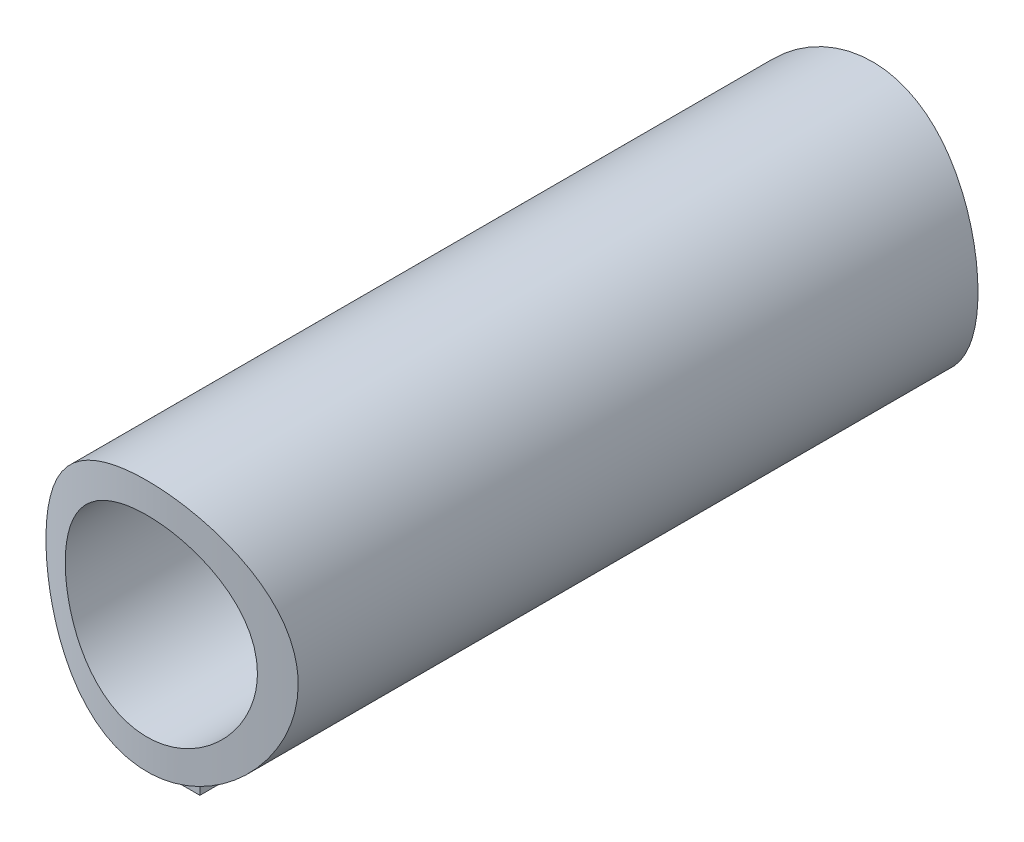
ISO-10303-21;
HEADER;
FILE_DESCRIPTION(('STEP AP214'),'2;1');
FILE_NAME('part.step','',(''),(''),'','','');
FILE_SCHEMA(('AUTOMOTIVE_DESIGN { 1 0 10303 214 1 1 1 1 }'));
ENDSEC;
DATA;
#1=APPLICATION_CONTEXT('core data for automotive mechanical design processes');
#2=APPLICATION_PROTOCOL_DEFINITION('international standard','automotive_design',2000,#1);
#3=PRODUCT_CONTEXT('',#1,'mechanical');
#4=PRODUCT('Part','Part','',(#3));
#5=PRODUCT_RELATED_PRODUCT_CATEGORY('part','',(#4));
#6=PRODUCT_DEFINITION_FORMATION('','',#4);
#7=PRODUCT_DEFINITION_CONTEXT('part definition',#1,'design');
#8=PRODUCT_DEFINITION('design','',#6,#7);
#9=PRODUCT_DEFINITION_SHAPE('','',#8);
#10=(LENGTH_UNIT() NAMED_UNIT(*) SI_UNIT(.MILLI.,.METRE.));
#11=(NAMED_UNIT(*) PLANE_ANGLE_UNIT() SI_UNIT($,.RADIAN.));
#12=(NAMED_UNIT(*) SI_UNIT($,.STERADIAN.) SOLID_ANGLE_UNIT());
#13=UNCERTAINTY_MEASURE_WITH_UNIT(LENGTH_MEASURE(1.E-05),#10,'distance_accuracy_value','');
#14=(GEOMETRIC_REPRESENTATION_CONTEXT(3) GLOBAL_UNCERTAINTY_ASSIGNED_CONTEXT((#13)) GLOBAL_UNIT_ASSIGNED_CONTEXT((#10,
#11,#12)) REPRESENTATION_CONTEXT('',''));
#15=CARTESIAN_POINT('',(0.,0.,0.));
#16=DIRECTION('',(0.,0.,1.));
#17=DIRECTION('',(1.,0.,0.));
#18=AXIS2_PLACEMENT_3D('',#15,#16,#17);
#19=CARTESIAN_POINT('',(0.,27.7,5.12008753705083));
#20=DIRECTION('',(0.,0.,1.));
#21=DIRECTION('',(1.,0.,0.));
#22=AXIS2_PLACEMENT_3D('',#19,#20,#21);
#23=CYLINDRICAL_SURFACE('',#22,5.24999999999999);
#24=CARTESIAN_POINT('',(5.24999999999999,27.7,12.7082650271388));
#25=CARTESIAN_POINT('',(5.25000081426526,27.5584882212092,12.7082642706655));
#26=CARTESIAN_POINT('',(5.24427381952558,27.4169872559511,12.710635028305));
#27=CARTESIAN_POINT('',(5.22142733937642,27.1350155431658,12.7200373823877));
#28=CARTESIAN_POINT('',(5.20430424748061,26.9945451360084,12.7270704542959));
#29=CARTESIAN_POINT('',(5.15885422108239,26.7157961534185,12.7455608695037));
#30=CARTESIAN_POINT('',(5.13053243624435,26.5775166008875,12.7570161792017));
#31=CARTESIAN_POINT('',(5.06295950390954,26.3040072582898,12.7839846247942));
#32=CARTESIAN_POINT('',(5.02370402001332,26.1687787013251,12.7994993705478));
#33=CARTESIAN_POINT('',(4.93475857551873,25.9027046711733,12.8340533050327));
#34=CARTESIAN_POINT('',(4.88509940130361,25.7718475581221,12.8530820758674));
#35=CARTESIAN_POINT('',(4.77569994365504,25.5148865816249,12.894130511463));
#36=CARTESIAN_POINT('',(4.71595590269005,25.3887845113692,12.9161512904206));
#37=CARTESIAN_POINT('',(4.5222567183154,25.0187551155574,12.985781875291));
#38=CARTESIAN_POINT('',(4.37377025130471,24.7829137759519,13.0369861237909));
#39=CARTESIAN_POINT('',(4.03434233690231,24.3279029456584,13.1460944101636));
#40=CARTESIAN_POINT('',(3.84173634899724,24.1100341430341,13.2042000397285));
#41=CARTESIAN_POINT('',(3.4228214580564,23.7086599141168,13.3189257148373));
#42=CARTESIAN_POINT('',(3.19650504233523,23.5251621683681,13.3755454259135));
#43=CARTESIAN_POINT('',(2.8316824558816,23.2765562212819,13.4558696137225));
#44=CARTESIAN_POINT('',(2.70338814547523,23.1969961987161,13.4822921501562));
#45=CARTESIAN_POINT('',(2.44003556671751,23.0490323929584,13.5324296242493));
#46=CARTESIAN_POINT('',(2.30498004974486,22.9806241191845,13.5561456506054));
#47=CARTESIAN_POINT('',(2.02898559600622,22.8555512385648,13.6001932375819));
#48=CARTESIAN_POINT('',(1.88804579476277,22.7988883646158,13.6205242987032));
#49=CARTESIAN_POINT('',(1.60137937832128,22.6978842840226,13.6571939338561));
#50=CARTESIAN_POINT('',(1.45565507978956,22.6535372096244,13.6735344087181));
#51=CARTESIAN_POINT('',(1.16701576886645,22.579278190665,13.7011188345392));
#52=CARTESIAN_POINT('',(1.02426082862582,22.5488153219576,13.7125559650768));
#53=CARTESIAN_POINT('',(0.736488333640709,22.4998677379794,13.7310181898127));
#54=CARTESIAN_POINT('',(0.591471778637265,22.4813778756237,13.7380451798496));
#55=CARTESIAN_POINT('',(0.300264576566376,22.456557018798,13.7474929498118));
#56=CARTESIAN_POINT('',(0.154074031965661,22.4502249745214,13.7499141274408));
#57=CARTESIAN_POINT('',(-0.138325859733034,22.4497868352383,13.7500813633812));
#58=CARTESIAN_POINT('',(-0.284535206092935,22.455680354797,13.7478275690803));
#59=CARTESIAN_POINT('',(-0.568297432300707,22.4790087172609,13.7389461989205));
#60=CARTESIAN_POINT('',(-0.705908246466148,22.4958333802855,13.7325499151347));
#61=CARTESIAN_POINT('',(-0.979178449565625,22.5402637434455,13.7157739467839));
#62=CARTESIAN_POINT('',(-1.11483717103933,22.5678730443255,13.7053929318282));
#63=CARTESIAN_POINT('',(-1.3831893016849,22.6336043301045,13.6809150294558));
#64=CARTESIAN_POINT('',(-1.51588367027511,22.6717228587813,13.6668193637618));
#65=CARTESIAN_POINT('',(-1.77754629231653,22.7581558236761,13.6352559985183));
#66=CARTESIAN_POINT('',(-1.9065131119086,22.8064741255785,13.6177870207078));
#67=CARTESIAN_POINT('',(-2.16170754374481,22.9136713084111,13.5796316781061));
#68=CARTESIAN_POINT('',(-2.28786953215911,22.9726914402714,13.558902842785));
#69=CARTESIAN_POINT('',(-2.53478779572207,23.1003596313441,13.5149217174777));
#70=CARTESIAN_POINT('',(-2.6555420661041,23.1690112228151,13.4916685024069));
#71=CARTESIAN_POINT('',(-3.00861653640624,23.3886802439851,13.4189535379637));
#72=CARTESIAN_POINT('',(-3.23192102218348,23.5534848726967,13.3665095116953));
#73=CARTESIAN_POINT('',(-3.66207069668216,23.9267198873728,13.2553435530956));
#74=CARTESIAN_POINT('',(-3.86710524702418,24.1371850430978,13.1964337619683));
#75=CARTESIAN_POINT('',(-4.14640014558021,24.4764300107196,13.1102787342213));
#76=CARTESIAN_POINT('',(-4.23483785350226,24.593521062942,13.0819107215866));
#77=CARTESIAN_POINT('',(-4.40174388541626,24.834925044979,13.02669812448));
#78=CARTESIAN_POINT('',(-4.48021589121036,24.9592352828043,12.9998529794287));
#79=CARTESIAN_POINT('',(-4.62840865058345,25.2174542751351,12.9478436981503));
#80=CARTESIAN_POINT('',(-4.69787107750981,25.3515226807751,12.9227361040646));
#81=CARTESIAN_POINT('',(-4.82514635943128,25.6255666369926,12.8757549157181));
#82=CARTESIAN_POINT('',(-4.88296389347412,25.7655397875247,12.8538800234661));
#83=CARTESIAN_POINT('',(-4.98641885343549,26.0504283771143,12.814101669551));
#84=CARTESIAN_POINT('',(-5.03205949447509,26.1953425001648,12.7961971597808));
#85=CARTESIAN_POINT('',(-5.11069435689368,26.4890462774304,12.7649949938056));
#86=CARTESIAN_POINT('',(-5.14368948613183,26.6378356526102,12.751697006891));
#87=CARTESIAN_POINT('',(-5.19514892886083,26.9295446470971,12.7308150948169));
#88=CARTESIAN_POINT('',(-5.21433224188918,27.0723175365735,12.7229494746941));
#89=CARTESIAN_POINT('',(-5.24090185741831,27.3591371991479,12.7120280157931));
#90=CARTESIAN_POINT('',(-5.24828876938477,27.503183906047,12.7089719285286));
#91=CARTESIAN_POINT('',(-5.25118189044998,27.7913842946795,12.7077767987042));
#92=CARTESIAN_POINT('',(-5.24669076531835,27.9355379451528,12.7096366528671));
#93=CARTESIAN_POINT('',(-5.2258859965639,28.2228392475486,12.7182050953039));
#94=CARTESIAN_POINT('',(-5.20957259961695,28.3659869203984,12.7249135824094));
#95=CARTESIAN_POINT('',(-5.16641369091962,28.6430379798022,12.7424951991453));
#96=CARTESIAN_POINT('',(-5.14013803548301,28.7770446774504,12.7531423446526));
#97=CARTESIAN_POINT('',(-5.07734032844071,29.0422808276914,12.7782723415018));
#98=CARTESIAN_POINT('',(-5.0408149370788,29.173509360038,12.7927564429844));
#99=CARTESIAN_POINT('',(-4.91632502967816,29.5617076224615,12.8413507467727));
#100=CARTESIAN_POINT('',(-4.81341213849103,29.8134094208951,12.880617926464));
#101=CARTESIAN_POINT('',(-4.56631772295618,30.305783672082,12.9703140244544));
#102=CARTESIAN_POINT('',(-4.42070461465995,30.5456627039841,13.0211133146724));
#103=CARTESIAN_POINT('',(-4.09385987067837,30.9986185126855,13.1275423225492));
#104=CARTESIAN_POINT('',(-3.9126147910319,31.2116851232254,13.1831738589812));
#105=CARTESIAN_POINT('',(-3.50530547566449,31.6196526714156,13.2974721906185));
#106=CARTESIAN_POINT('',(-3.27706955367581,31.8124196183877,13.3560963354191));
#107=CARTESIAN_POINT('',(-2.91210523465434,32.0708657804028,13.4386687778697));
#108=CARTESIAN_POINT('',(-2.78660355808959,32.151934804506,13.4653127057657));
#109=CARTESIAN_POINT('',(-2.52878495011081,32.303265084905,13.5161002491059));
#110=CARTESIAN_POINT('',(-2.39647096574597,32.373530963135,13.5402449323549));
#111=CARTESIAN_POINT('',(-2.12617868210354,32.50252519076,13.5853083379527));
#112=CARTESIAN_POINT('',(-1.98821352735811,32.5612786592641,13.6062340618469));
#113=CARTESIAN_POINT('',(-1.7073553513463,32.6668834614615,13.6443213576781));
#114=CARTESIAN_POINT('',(-1.56446442910657,32.7137397954033,13.661484510571));
#115=CARTESIAN_POINT('',(-1.274795711713,32.7950980140135,13.6915519184369));
#116=CARTESIAN_POINT('',(-1.12801866239906,32.829602251146,13.7044569843283));
#117=CARTESIAN_POINT('',(-0.83171788844024,32.8858925334871,13.7256256377147));
#118=CARTESIAN_POINT('',(-0.682194329591945,32.9076793438139,13.7338895044369));
#119=CARTESIAN_POINT('',(-0.390721722025437,32.9373641683161,13.7451740330194));
#120=CARTESIAN_POINT('',(-0.248860595224904,32.9460215158067,13.7484812108265));
#121=CARTESIAN_POINT('',(0.0351818282793541,32.95180403931,13.7506886200064));
#122=CARTESIAN_POINT('',(0.177363216946322,32.948925318898,13.7495873623852));
#123=CARTESIAN_POINT('',(0.460850326191192,32.9316607084885,13.743005885216));
#124=CARTESIAN_POINT('',(0.602156447274364,32.9172805448228,13.7375278447795));
#125=CARTESIAN_POINT('',(0.882968662082063,32.8771604412257,13.7223411172668));
#126=CARTESIAN_POINT('',(1.02247406401461,32.8514162617984,13.7126308513202));
#127=CARTESIAN_POINT('',(1.29496929247254,32.7896515660941,13.6895491634484));
#128=CARTESIAN_POINT('',(1.42803384339405,32.7539210609485,13.6762814410586));
#129=CARTESIAN_POINT('',(1.69063696595359,32.6722393400807,13.6463079748078));
#130=CARTESIAN_POINT('',(1.82017427726743,32.6262845235124,13.629601019857));
#131=CARTESIAN_POINT('',(2.07485984689523,32.5245466808581,13.5931598464051));
#132=CARTESIAN_POINT('',(2.20000905787979,32.4687658040818,13.5734262900515));
#133=CARTESIAN_POINT('',(2.44524487814481,32.3477949208628,13.5314001416719));
#134=CARTESIAN_POINT('',(2.56532964144747,32.282601521232,13.509106627384));
#135=CARTESIAN_POINT('',(2.92688784787617,32.0676663011782,13.4371759120733));
#136=CARTESIAN_POINT('',(3.15892526616519,31.9028451677253,13.384081449829));
#137=CARTESIAN_POINT('',(3.59293459548534,31.5384475423984,13.2741703406672));
#138=CARTESIAN_POINT('',(3.79489557622454,31.3388584721575,13.2173523513063));
#139=CARTESIAN_POINT('',(4.07697890084356,31.0110597167735,13.1320655139021));
#140=CARTESIAN_POINT('',(4.16962632786875,30.8936056346456,13.1028699961905));
#141=CARTESIAN_POINT('',(4.3446937263283,30.6510142909855,13.04586523179));
#142=CARTESIAN_POINT('',(4.42711737621544,30.5258798171761,13.0180554886749));
#143=CARTESIAN_POINT('',(4.5811936198379,30.2685926328704,12.9646374638286));
#144=CARTESIAN_POINT('',(4.65283943391208,30.1364355750419,12.9390305720728));
#145=CARTESIAN_POINT('',(4.78469100060272,29.8660658430678,12.8908555929897));
#146=CARTESIAN_POINT('',(4.84490158197895,29.7278557554133,12.8682862241848));
#147=CARTESIAN_POINT('',(4.95664007316946,29.4377602007872,12.8256779370326));
#148=CARTESIAN_POINT('',(5.00742492437787,29.285552758486,12.8058738543799));
#149=CARTESIAN_POINT('',(5.09493805339264,28.9766600694699,12.7713085994248));
#150=CARTESIAN_POINT('',(5.13167275218234,28.8199769034493,12.756545123874));
#151=CARTESIAN_POINT('',(5.19063825678636,28.503534322975,12.7326662297904));
#152=CARTESIAN_POINT('',(5.21287431937738,28.3437760451193,12.7235487642417));
#153=CARTESIAN_POINT('',(5.2425536937104,28.0226736769354,12.7113490156189));
#154=CARTESIAN_POINT('',(5.24999907170086,27.861329811278,12.7082658895526));
#155=CARTESIAN_POINT('',(5.24999999999999,27.7,12.7082650271388));
#156=B_SPLINE_CURVE_WITH_KNOTS('',3,(#24,#25,#26,#27,#28,#29,#30,#31,#32,#33,#34,#35,#36,#37,
#38,#39,#40,#41,#42,#43,#44,#45,#46,#47,#48,#49,#50,#51,#52,#53,#54,#55,#56,#57,#58,#59,#60,#61,
#62,#63,#64,#65,#66,#67,#68,#69,#70,#71,#72,#73,#74,#75,#76,#77,#78,#79,#80,#81,#82,#83,#84,#85,
#86,#87,#88,#89,#90,#91,#92,#93,#94,#95,#96,#97,#98,#99,#100,#101,#102,#103,#104,#105,#106,#107,
#108,#109,#110,#111,#112,#113,#114,#115,#116,#117,#118,#119,#120,#121,#122,#123,#124,#125,#126,
#127,#128,#129,#130,#131,#132,#133,#134,#135,#136,#137,#138,#139,#140,#141,#142,#143,#144,#145,
#146,#147,#148,#149,#150,#151,#152,#153,#154,#155),.UNSPECIFIED.,.T.,.F.,(4,2,2,2,2,2,2,2,2,2,2,
2,2,2,2,2,2,2,2,2,2,2,2,2,2,2,2,2,2,2,2,2,2,2,2,2,2,2,2,2,2,2,2,2,2,2,2,2,2,2,2,2,2,2,2,2,2,2,2,
2,2,2,2,2,2,4),(0.,0.424381811142941,0.848897988939124,1.27321918164073,1.69770890401588,
2.12095979299002,2.54436873097641,3.39058452822539,4.27648826911013,5.1625897381767,
5.62187824032426,6.08098133704766,6.54015212094304,6.99910376018476,7.43779026397279,
7.87628805506315,8.31474798092215,8.75319408368751,9.16905405359718,9.58505298850567,
10.0009152746338,10.4169354552387,10.8389099488696,11.2610396046981,12.1047374297537,
12.9994304601291,13.4473671548486,13.8951378761204,14.353765694543,14.8122088619288,
15.2705308643965,15.7288199563889,16.1610740026868,16.5933057156876,17.0254404318216,
17.457566131572,17.8679979232538,18.278563604915,19.0990350703025,19.950978700768,
20.8032443890438,21.7118872641131,22.1667308662364,22.6213793268268,23.0750244577427,
23.528478609296,23.9818463542404,24.4351868204197,24.8611482690587,25.287253602648,
25.7131469191317,26.1391992551952,26.5539755030158,26.9688980605724,27.3837299722098,
27.7987118047277,28.6632800575492,29.5281617465139,29.9849566132478,30.4415866482828,
30.8985027302468,31.3552254390046,31.8395046355871,32.3235622491837,32.8074442600695,
33.2912586682166),.UNSPECIFIED.);
#157=CARTESIAN_POINT('',(5.24999999999999,27.7,12.7082650271388));
#158=VERTEX_POINT('',#157);
#159=EDGE_CURVE('E144',#158,#158,#156,.T.);
#160=ORIENTED_EDGE('',*,*,#159,.T.);
#161=EDGE_LOOP('',(#160));
#162=FACE_BOUND('',#161,.T.);
#163=CARTESIAN_POINT('',(5.24999999999999,27.7,-15.5897402159241));
#164=CARTESIAN_POINT('',(5.24999902964756,27.9867148879715,-15.5897412226706));
#165=CARTESIAN_POINT('',(5.22643308617955,28.2734408353123,-15.5977363027939));
#166=CARTESIAN_POINT('',(5.13307658074796,28.8384468595175,-15.6287037669836));
#167=CARTESIAN_POINT('',(5.06327509446421,29.1167249241004,-15.6516796906344));
#168=CARTESIAN_POINT('',(4.88010989433084,29.656566514592,-15.7097471790722));
#169=CARTESIAN_POINT('',(4.76682583092901,29.9181595879196,-15.7448165794266));
#170=CARTESIAN_POINT('',(4.5001790067218,30.4187039260573,-15.8230883451598));
#171=CARTESIAN_POINT('',(4.34680859632249,30.6576508574798,-15.8662922623909));
#172=CARTESIAN_POINT('',(3.99845560907926,31.1146838342681,-15.9577017275005));
#173=CARTESIAN_POINT('',(3.80228230345719,31.3318391325708,-16.006024217168));
#174=CARTESIAN_POINT('',(3.37643799840256,31.7307958471277,-16.1012331370643));
#175=CARTESIAN_POINT('',(3.14676211780573,31.912592102718,-16.1481193568288));
#176=CARTESIAN_POINT('',(2.65370703033303,32.2398135024084,-16.2365156919818));
#177=CARTESIAN_POINT('',(2.38965824629562,32.3842749028061,-16.2778721197856));
#178=CARTESIAN_POINT('',(1.83946574645772,32.6263707718193,-16.3491796983244));
#179=CARTESIAN_POINT('',(1.55332748049276,32.7240167479688,-16.3791336514879));
#180=CARTESIAN_POINT('',(0.976828037450925,32.8665871090581,-16.4234333694986));
#181=CARTESIAN_POINT('',(0.686897351196188,32.9131034383256,-16.4382493502688));
#182=CARTESIAN_POINT('',(0.102993070846096,32.9571436047171,-16.4522671120603));
#183=CARTESIAN_POINT('',(-0.190979549382993,32.9546790435608,-16.4514725906195));
#184=CARTESIAN_POINT('',(-0.763398741913072,32.9018629227033,-16.4346835446599));
#185=CARTESIAN_POINT('',(-1.04202330502125,32.8532381343861,-16.4192371373791));
#186=CARTESIAN_POINT('',(-1.58692802938263,32.7123221002562,-16.3755584084979));
#187=CARTESIAN_POINT('',(-1.85320737322734,32.6200279675057,-16.3473252415825));
#188=CARTESIAN_POINT('',(-2.369781600439,32.3933157277229,-16.28052139739));
#189=CARTESIAN_POINT('',(-2.61983416609183,32.2583838999331,-16.2418255275598));
#190=CARTESIAN_POINT('',(-3.09427668963736,31.9506419912966,-16.1581580709141));
#191=CARTESIAN_POINT('',(-3.31865992484017,31.7778220221083,-16.1131848469014));
#192=CARTESIAN_POINT('',(-3.74568413579192,31.3903947301776,-16.0194330558587));
#193=CARTESIAN_POINT('',(-3.94695991006467,31.1743000368529,-15.9705740442271));
#194=CARTESIAN_POINT('',(-4.31083358584651,30.7109791846732,-15.8762287247341));
#195=CARTESIAN_POINT('',(-4.47342651404192,30.4637490290865,-15.8307428510618));
#196=CARTESIAN_POINT('',(-4.75700000754801,29.9411723579996,-15.7478769996235));
#197=CARTESIAN_POINT('',(-4.87745311650756,29.665521762739,-15.710601791393));
#198=CARTESIAN_POINT('',(-5.06979216329453,29.0963692825646,-15.64960087457));
#199=CARTESIAN_POINT('',(-5.14169644658926,28.8028741864216,-15.6258700483969));
#200=CARTESIAN_POINT('',(-5.23221760937516,28.219489647761,-15.5957876588323));
#201=CARTESIAN_POINT('',(-5.25293330122398,27.9299609829626,-15.5887520719285));
#202=CARTESIAN_POINT('',(-5.24639797921651,27.3515372317767,-15.5909535498299));
#203=CARTESIAN_POINT('',(-5.2191547721494,27.0626420499347,-15.6001879661908));
#204=CARTESIAN_POINT('',(-5.11935400973588,26.5028795568276,-15.6332115358675));
#205=CARTESIAN_POINT('',(-5.04820743336316,26.2317311112906,-15.6565470374431));
#206=CARTESIAN_POINT('',(-4.86428748358637,25.7052579830335,-15.7146570293234));
#207=CARTESIAN_POINT('',(-4.75150713081952,25.4499359617943,-15.7494334374412));
#208=CARTESIAN_POINT('',(-4.48370922273055,24.9539808424672,-15.8277860586514));
#209=CARTESIAN_POINT('',(-4.3275383547435,24.7140078371526,-15.8715926373753));
#210=CARTESIAN_POINT('',(-3.97872647727894,24.2629115497345,-15.9626022560663));
#211=CARTESIAN_POINT('',(-3.78607559042844,24.0517961078577,-16.0098062137608));
#212=CARTESIAN_POINT('',(-3.35980799597504,23.6549276794799,-16.1047765530445));
#213=CARTESIAN_POINT('',(-3.12477372755371,23.4706776078556,-16.1524780650207));
#214=CARTESIAN_POINT('',(-2.62596187123,23.144162173046,-16.2410249886657));
#215=CARTESIAN_POINT('',(-2.36218552222695,23.0018950012081,-16.2818706956547));
#216=CARTESIAN_POINT('',(-1.81491758997605,22.7647351484662,-16.3518819960859));
#217=CARTESIAN_POINT('',(-1.53158191524996,22.6695081977123,-16.3811297031653));
#218=CARTESIAN_POINT('',(-0.95181278378139,22.5283963894348,-16.4250092173361));
#219=CARTESIAN_POINT('',(-0.655383653726228,22.4824953574581,-16.4396458154417));
#220=CARTESIAN_POINT('',(-0.07164835861144,22.4426972696136,-16.4523226014711));
#221=CARTESIAN_POINT('',(0.215496784470613,22.4466337049308,-16.4510542260064));
#222=CARTESIAN_POINT('',(0.784847274727184,22.5011267376838,-16.4337342295479));
#223=CARTESIAN_POINT('',(1.06705296645017,22.5516800700736,-16.4176836438997));
#224=CARTESIAN_POINT('',(1.61474672043706,22.6965730693293,-16.3728326992508));
#225=CARTESIAN_POINT('',(1.88040926194224,22.7903112986259,-16.3442077111281));
#226=CARTESIAN_POINT('',(2.39235701602922,23.0183661467396,-16.2771575020497));
#227=CARTESIAN_POINT('',(2.63863883050781,23.1526898616859,-16.2387305674656));
#228=CARTESIAN_POINT('',(3.11419553078893,23.4635187012003,-16.1544009386312));
#229=CARTESIAN_POINT('',(3.34257649192327,23.6413327417761,-16.1082840874185));
#230=CARTESIAN_POINT('',(3.76697423464853,24.0318122389366,-16.014360394676));
#231=CARTESIAN_POINT('',(3.96298109483851,24.2444883397464,-15.9665530405023));
#232=CARTESIAN_POINT('',(4.3240033799019,24.7075671367957,-15.8726670210047));
#233=CARTESIAN_POINT('',(4.48769455621718,24.9590294495076,-15.826707360229));
#234=CARTESIAN_POINT('',(4.77033350435012,25.4872934839551,-15.7438313798706));
#235=CARTESIAN_POINT('',(4.88929743411297,25.7640860100042,-15.7069117961981));
#236=CARTESIAN_POINT('',(5.0715543617052,26.3144822222265,-15.6489724663101));
#237=CARTESIAN_POINT('',(5.13826796997676,26.5868527863703,-15.626991358322));
#238=CARTESIAN_POINT('',(5.22748519362372,27.139480169156,-15.5973767109004));
#239=CARTESIAN_POINT('',(5.25000094852422,27.4197348008771,-15.5897392318244));
#240=CARTESIAN_POINT('',(5.24999999999999,27.7,-15.5897402159241));
#241=B_SPLINE_CURVE_WITH_KNOTS('',3,(#163,#164,#165,#166,#167,#168,#169,#170,#171,#172,#173,
#174,#175,#176,#177,#178,#179,#180,#181,#182,#183,#184,#185,#186,#187,#188,#189,#190,#191,#192,
#193,#194,#195,#196,#197,#198,#199,#200,#201,#202,#203,#204,#205,#206,#207,#208,#209,#210,#211,
#212,#213,#214,#215,#216,#217,#218,#219,#220,#221,#222,#223,#224,#225,#226,#227,#228,#229,#230,
#231,#232,#233,#234,#235,#236,#237,#238,#239,#240),.UNSPECIFIED.,.T.,.F.,(4,2,2,2,2,2,2,2,2,2,2,
2,2,2,2,2,2,2,2,2,2,2,2,2,2,2,2,2,2,2,2,2,2,2,2,2,2,2,4),(0.,0.859108578094271,1.71842021482959,
2.57616523753995,3.43407406159995,4.31987389331407,5.2058029109517,6.11272126268696,
7.01941657358976,7.89700312682832,8.77438181549687,9.62018134495649,10.4660367972138,
11.3224992666477,12.1791855289767,13.0730301100684,13.9669895475004,14.8717686719156,
15.7762057097992,16.6428940370615,17.5094412971271,18.3494934137637,19.1896864182418,
20.0547941553136,20.9201364657817,21.8231244292922,22.7260734857735,23.6225103789144,
24.5186532318177,25.3759782462153,26.2332432181565,27.0789140630436,27.9247328540605,
28.8000808395574,29.6756965893635,30.5819479214514,31.4878715503462,32.3278851219212,
33.1676679403557),.UNSPECIFIED.);
#242=CARTESIAN_POINT('',(5.24999999999999,27.7,-15.5897402159241));
#243=VERTEX_POINT('',#242);
#244=EDGE_CURVE('E156',#243,#243,#241,.T.);
#245=ORIENTED_EDGE('',*,*,#244,.T.);
#246=EDGE_LOOP('',(#245));
#247=FACE_BOUND('',#246,.T.);
#248=CARTESIAN_POINT('',(0.,27.7,11.95));
#249=DIRECTION('',(0.,0.,-1.));
#250=DIRECTION('',(-1.,0.,0.));
#251=AXIS2_PLACEMENT_3D('',#248,#249,#250);
#252=CIRCLE('',#251,5.24999999999999);
#253=CARTESIAN_POINT('',(0.4,22.4652602739009,11.95));
#254=VERTEX_POINT('',#253);
#255=CARTESIAN_POINT('',(-0.4,22.4652602739009,11.95));
#256=VERTEX_POINT('',#255);
#257=EDGE_CURVE('E11',#254,#256,#252,.T.);
#258=ORIENTED_EDGE('',*,*,#257,.F.);
#259=DIRECTION('',(0.,0.,1.));
#260=VECTOR('',#259,1.);
#261=CARTESIAN_POINT('',(0.4,22.4652602739009,5.12008753705083));
#262=LINE('',#261,#260);
#263=CARTESIAN_POINT('',(0.4,22.4652602739009,-16.05));
#264=VERTEX_POINT('',#263);
#265=EDGE_CURVE('E106',#254,#264,#262,.F.);
#266=ORIENTED_EDGE('',*,*,#265,.T.);
#267=CARTESIAN_POINT('',(0.,27.7,-16.05));
#268=DIRECTION('',(0.,0.,-1.));
#269=DIRECTION('',(-1.,0.,0.));
#270=AXIS2_PLACEMENT_3D('',#267,#268,#269);
#271=CIRCLE('',#270,5.24999999999999);
#272=CARTESIAN_POINT('',(-0.4,22.4652602739009,-16.05));
#273=VERTEX_POINT('',#272);
#274=EDGE_CURVE('E217',#264,#273,#271,.T.);
#275=ORIENTED_EDGE('',*,*,#274,.T.);
#276=DIRECTION('',(0.,0.,1.));
#277=VECTOR('',#276,1.);
#278=CARTESIAN_POINT('',(-0.4,22.4652602739009,5.12008753705083));
#279=LINE('',#278,#277);
#280=EDGE_CURVE('E42',#273,#256,#279,.T.);
#281=ORIENTED_EDGE('',*,*,#280,.T.);
#282=EDGE_LOOP('',(#258,#266,#275,#281));
#283=FACE_BOUND('',#282,.T.);
#284=ADVANCED_FACE('F34',(#162,#247,#283),#23,.T.);
#285=CARTESIAN_POINT('',(0.,27.7,5.12008753705083));
#286=DIRECTION('',(0.,0.,1.));
#287=DIRECTION('',(1.,0.,0.));
#288=AXIS2_PLACEMENT_3D('',#285,#286,#287);
#289=CYLINDRICAL_SURFACE('',#288,4.);
#290=CARTESIAN_POINT('',(0.,27.7,-3.));
#291=DIRECTION('',(0.,0.,1.));
#292=DIRECTION('',(1.,0.,0.));
#293=AXIS2_PLACEMENT_3D('',#290,#291,#292);
#294=CIRCLE('',#293,4.);
#295=CARTESIAN_POINT('',(4.,27.7,-3.));
#296=VERTEX_POINT('',#295);
#297=EDGE_CURVE('E181',#296,#296,#294,.T.);
#298=ORIENTED_EDGE('',*,*,#297,.F.);
#299=EDGE_LOOP('',(#298));
#300=FACE_BOUND('',#299,.T.);
#301=CARTESIAN_POINT('',(4.,27.7,13.1553221169229));
#302=CARTESIAN_POINT('',(3.99999646501596,27.9195179443546,13.1553249256662));
#303=CARTESIAN_POINT('',(3.98186794971122,28.1390712589598,13.1608767562862));
#304=CARTESIAN_POINT('',(3.9100054629455,28.5717811604853,13.182401969151));
#305=CARTESIAN_POINT('',(3.85625794587027,28.784935281597,13.1983793160985));
#306=CARTESIAN_POINT('',(3.71511909606634,29.1985216619993,13.2387962108917));
#307=CARTESIAN_POINT('',(3.62778123642618,29.3989735544438,13.2632223028344));
#308=CARTESIAN_POINT('',(3.42211449935945,29.7824243511553,13.3177665822941));
#309=CARTESIAN_POINT('',(3.30378159330918,29.9654209824299,13.3478855096035));
#310=CARTESIAN_POINT('',(3.03571497633824,30.3142119160096,13.4114267781233));
#311=CARTESIAN_POINT('',(2.88522119983698,30.4794099648825,13.4449162547288));
#312=CARTESIAN_POINT('',(2.55873532008622,30.7826150615913,13.5108500560887));
#313=CARTESIAN_POINT('',(2.3827401331353,30.9206188162479,13.5432942538643));
#314=CARTESIAN_POINT('',(2.00603597167549,31.1680777840393,13.6042407242982));
#315=CARTESIAN_POINT('',(1.80491491182689,31.2769293462836,13.6326546395958));
#316=CARTESIAN_POINT('',(1.3862571046382,31.4590382908284,13.6815618273462));
#317=CARTESIAN_POINT('',(1.16872368647972,31.5323028694999,13.7020567010094));
#318=CARTESIAN_POINT('',(0.729650247165854,31.6391972867604,13.73234165895));
#319=CARTESIAN_POINT('',(0.508377012377725,31.6738439128458,13.7424058477553));
#320=CARTESIAN_POINT('',(0.0629449244680566,31.7057294625226,13.7516588073689));
#321=CARTESIAN_POINT('',(-0.161213348771343,31.7029757896561,13.7508497305849));
#322=CARTESIAN_POINT('',(-0.598935201085731,31.6608309418763,13.7386430917102));
#323=CARTESIAN_POINT('',(-0.812614976407929,31.6225401052496,13.7275635467037));
#324=CARTESIAN_POINT('',(-1.23037326965881,31.5121996465341,13.6964441661569));
#325=CARTESIAN_POINT('',(-1.4344511934895,31.4401479385644,13.6764037769834));
#326=CARTESIAN_POINT('',(-1.82988282278237,31.2635586182574,13.6291657869628));
#327=CARTESIAN_POINT('',(-2.02106846324991,31.1586662836865,13.6018905569706));
#328=CARTESIAN_POINT('',(-2.38348311974339,30.919651271145,13.5430891884869));
#329=CARTESIAN_POINT('',(-2.55470761738741,30.7855219947752,13.5115620910172));
#330=CARTESIAN_POINT('',(-2.87890807275864,30.4860946419625,13.446291268961));
#331=CARTESIAN_POINT('',(-3.03099490109343,30.3198411201712,13.4125086263489));
#332=CARTESIAN_POINT('',(-3.30537115733599,29.9638526841189,13.3475449085101));
#333=CARTESIAN_POINT('',(-3.42765797969142,29.7741157187772,13.316364060927));
#334=CARTESIAN_POINT('',(-3.63981704987604,29.3743239689325,13.2599561982512));
#335=CARTESIAN_POINT('',(-3.72940348347927,29.1641094708628,13.2347823170916));
#336=CARTESIAN_POINT('',(-3.87165101467268,28.7306792050274,13.1938758114814));
#337=CARTESIAN_POINT('',(-3.92432331838729,28.507467405194,13.1781403220013));
#338=CARTESIAN_POINT('',(-3.98962250973631,28.0627999940935,13.1585159260396));
#339=CARTESIAN_POINT('',(-4.00359385562061,27.8415591804698,13.1542294804771));
#340=CARTESIAN_POINT('',(-3.99483489843486,27.399892815091,13.1568924542726));
#341=CARTESIAN_POINT('',(-3.97210937111727,27.1794671609922,13.1638404115791));
#342=CARTESIAN_POINT('',(-3.89179590131278,26.7511721959919,13.1878008507054));
#343=CARTESIAN_POINT('',(-3.83505720372534,26.5431285279214,13.2045679389451));
#344=CARTESIAN_POINT('',(-3.68930415485229,26.1395223684813,13.2460272564926));
#345=CARTESIAN_POINT('',(-3.60028502712658,25.9439617292275,13.2707206585716));
#346=CARTESIAN_POINT('',(-3.38989771872966,25.5653602921473,13.3260338504019));
#347=CARTESIAN_POINT('',(-3.26776241474579,25.3827660002557,13.3567887241364));
#348=CARTESIAN_POINT('',(-2.99553183074823,25.0401720950269,13.4204617916042));
#349=CARTESIAN_POINT('',(-2.8454302637019,24.8801775765412,13.4533804706986));
#350=CARTESIAN_POINT('',(-2.51523570167049,24.5815298622988,13.5190738194076));
#351=CARTESIAN_POINT('',(-2.33427332419793,24.4438255603079,13.5518026746293));
#352=CARTESIAN_POINT('',(-1.95103939826185,24.2007251672786,13.6122562062529));
#353=CARTESIAN_POINT('',(-1.7487689484794,24.0953274115534,13.6399811404659));
#354=CARTESIAN_POINT('',(-1.33004217444639,23.9208439494042,13.6871285755172));
#355=CARTESIAN_POINT('',(-1.11370749075321,23.8514840540104,13.7066135509008));
#356=CARTESIAN_POINT('',(-0.671789033383604,23.7503108846232,13.7353616368567));
#357=CARTESIAN_POINT('',(-0.446207750805183,23.7184875659185,13.7446274820044));
#358=CARTESIAN_POINT('',(-0.000994392089361017,23.694017390952,13.7517372927459));
#359=CARTESIAN_POINT('',(0.218556372884431,23.6999902875788,13.749983684864));
#360=CARTESIAN_POINT('',(0.65339438275825,23.7476703157253,13.736189236829));
#361=CARTESIAN_POINT('',(0.868681844456782,23.789375625373,13.7241489211596));
#362=CARTESIAN_POINT('',(1.28689123184519,23.9065015346866,13.6912392370478));
#363=CARTESIAN_POINT('',(1.48991175599931,23.9815957541929,13.6704554404825));
#364=CARTESIAN_POINT('',(1.88058201659317,24.1630771177466,13.6222133874514));
#365=CARTESIAN_POINT('',(2.06822931182182,24.2694692195138,13.5947540736746));
#366=CARTESIAN_POINT('',(2.4290557984778,24.5143030215865,13.5350166375937));
#367=CARTESIAN_POINT('',(2.60161745810772,24.6536249346596,13.5026168801554));
#368=CARTESIAN_POINT('',(2.92137561232888,24.9587548676171,13.437066629033));
#369=CARTESIAN_POINT('',(3.06856497008724,25.124570314529,13.403915927077));
#370=CARTESIAN_POINT('',(3.3374538819294,25.4834615046158,13.33954942239));
#371=CARTESIAN_POINT('',(3.45834045465928,25.6771618858846,13.308411977921));
#372=CARTESIAN_POINT('',(3.66568134156109,26.0830148350834,13.2528062427568));
#373=CARTESIAN_POINT('',(3.75215396627827,26.2951575170526,13.2283344077006));
#374=CARTESIAN_POINT('',(3.8794011378111,26.7048091054327,13.1915339604768));
#375=CARTESIAN_POINT('',(3.92450658345168,26.9008801614615,13.1780773854678));
#376=CARTESIAN_POINT('',(3.98480505719395,27.2979581607788,13.1599709359822));
#377=CARTESIAN_POINT('',(4.00000323735801,27.4989642478782,13.1553195446601));
#378=CARTESIAN_POINT('',(4.,27.7,13.1553221169229));
#379=B_SPLINE_CURVE_WITH_KNOTS('',3,(#301,#302,#303,#304,#305,#306,#307,#308,#309,#310,#311,
#312,#313,#314,#315,#316,#317,#318,#319,#320,#321,#322,#323,#324,#325,#326,#327,#328,#329,#330,
#331,#332,#333,#334,#335,#336,#337,#338,#339,#340,#341,#342,#343,#344,#345,#346,#347,#348,#349,
#350,#351,#352,#353,#354,#355,#356,#357,#358,#359,#360,#361,#362,#363,#364,#365,#366,#367,#368,
#369,#370,#371,#372,#373,#374,#375,#376,#377,#378),.UNSPECIFIED.,.T.,.F.,(4,2,2,2,2,2,2,2,2,2,2,
2,2,2,2,2,2,2,2,2,2,2,2,2,2,2,2,2,2,2,2,2,2,2,2,2,2,2,4),(0.,0.657812934398495,1.3158761733245,
1.97289613651688,2.63000153919325,3.30480961384324,3.9796993563649,4.66763955015836,
5.35544057126911,6.02466981986195,6.69376659372027,7.34281346438581,7.9919004410376,
8.64825547347256,9.30475879039766,9.98511642475646,10.6655335246034,11.3517628691667,
12.0377838028489,12.6996544832628,13.3614390343821,14.0073507506866,14.6533580796684,
15.3158410846827,15.9784732011046,16.6644185779702,17.3503286036013,18.0309406058163,
18.7113704362983,19.3670992834822,20.0227946993127,20.6722169099562,21.3217420473265,
21.991120183295,22.6606862987386,23.3486794325506,24.0363060165637,24.6388385599347,
25.241267297189),.UNSPECIFIED.);
#380=CARTESIAN_POINT('',(4.,27.7,13.1553221169229));
#381=VERTEX_POINT('',#380);
#382=EDGE_CURVE('E173',#381,#381,#379,.T.);
#383=ORIENTED_EDGE('',*,*,#382,.T.);
#384=EDGE_LOOP('',(#383));
#385=FACE_BOUND('',#384,.T.);
#386=ADVANCED_FACE('F186',(#300,#385),#289,.F.);
#387=CARTESIAN_POINT('',(0.,31.7,-3.));
#388=DIRECTION('',(0.,0.,-1.));
#389=DIRECTION('',(-1.,0.,0.));
#390=AXIS2_PLACEMENT_3D('',#387,#388,#389);
#391=PLANE('',#390);
#392=CARTESIAN_POINT('',(0.,27.7,-3.));
#393=DIRECTION('',(0.,0.,1.));
#394=DIRECTION('',(1.,0.,0.));
#395=AXIS2_PLACEMENT_3D('',#392,#393,#394);
#396=CIRCLE('',#395,1.75);
#397=CARTESIAN_POINT('',(1.75,27.7,-3.));
#398=VERTEX_POINT('',#397);
#399=EDGE_CURVE('E363',#398,#398,#396,.T.);
#400=ORIENTED_EDGE('',*,*,#399,.F.);
#401=EDGE_LOOP('',(#400));
#402=FACE_BOUND('',#401,.T.);
#403=ORIENTED_EDGE('',*,*,#297,.T.);
#404=EDGE_LOOP('',(#403));
#405=FACE_BOUND('',#404,.T.);
#406=ADVANCED_FACE('F190',(#402,#405),#391,.F.);
#407=CARTESIAN_POINT('',(0.,27.7,5.12008753705083));
#408=DIRECTION('',(0.,0.,1.));
#409=DIRECTION('',(1.,0.,0.));
#410=AXIS2_PLACEMENT_3D('',#407,#408,#409);
#411=CYLINDRICAL_SURFACE('',#410,1.75);
#412=CARTESIAN_POINT('',(0.,27.7,0.999999999999997));
#413=DIRECTION('',(0.,0.,1.));
#414=DIRECTION('',(1.,0.,0.));
#415=AXIS2_PLACEMENT_3D('',#412,#413,#414);
#416=CIRCLE('',#415,1.75);
#417=CARTESIAN_POINT('',(1.75,27.7,0.999999999999997));
#418=VERTEX_POINT('',#417);
#419=EDGE_CURVE('E157',#418,#418,#416,.T.);
#420=ORIENTED_EDGE('',*,*,#419,.F.);
#421=EDGE_LOOP('',(#420));
#422=FACE_BOUND('',#421,.T.);
#423=ORIENTED_EDGE('',*,*,#399,.T.);
#424=EDGE_LOOP('',(#423));
#425=FACE_BOUND('',#424,.T.);
#426=ADVANCED_FACE('F194',(#422,#425),#411,.T.);
#427=CARTESIAN_POINT('',(0.,29.45,0.999999999999997));
#428=DIRECTION('',(0.,0.,-1.));
#429=DIRECTION('',(-1.,0.,0.));
#430=AXIS2_PLACEMENT_3D('',#427,#428,#429);
#431=PLANE('',#430);
#432=ORIENTED_EDGE('',*,*,#419,.T.);
#433=EDGE_LOOP('',(#432));
#434=FACE_BOUND('',#433,.T.);
#435=ADVANCED_FACE('F165',(#434),#431,.F.);
#436=CARTESIAN_POINT('',(0.,15.,0.));
#437=DIRECTION('',(0.,1.,0.));
#438=DIRECTION('',(0.,0.,1.));
#439=AXIS2_PLACEMENT_3D('',#436,#437,#438);
#440=CYLINDRICAL_SURFACE('',#439,13.75);
#441=ORIENTED_EDGE('',*,*,#382,.F.);
#442=EDGE_LOOP('',(#441));
#443=FACE_BOUND('',#442,.T.);
#444=ORIENTED_EDGE('',*,*,#159,.F.);
#445=EDGE_LOOP('',(#444));
#446=FACE_BOUND('',#445,.T.);
#447=ADVANCED_FACE('F159',(#443,#446),#440,.T.);
#448=CARTESIAN_POINT('',(0.,15.,0.));
#449=DIRECTION('',(0.,1.,0.));
#450=DIRECTION('',(0.,0.,1.));
#451=AXIS2_PLACEMENT_3D('',#448,#449,#450);
#452=CYLINDRICAL_SURFACE('',#451,16.45);
#453=CARTESIAN_POINT('',(0.,29.2,0.));
#454=DIRECTION('',(0.,1.,0.));
#455=DIRECTION('',(0.,0.,1.));
#456=AXIS2_PLACEMENT_3D('',#453,#454,#455);
#457=CIRCLE('',#456,16.45);
#458=CARTESIAN_POINT('',(1.4,29.2,-16.3903172635553));
#459=VERTEX_POINT('',#458);
#460=CARTESIAN_POINT('',(-1.4,29.2,-16.3903172635553));
#461=VERTEX_POINT('',#460);
#462=EDGE_CURVE('E180',#459,#461,#457,.T.);
#463=ORIENTED_EDGE('',*,*,#462,.T.);
#464=DIRECTION('',(0.,1.,0.));
#465=VECTOR('',#464,1.);
#466=CARTESIAN_POINT('',(-1.4,15.,-16.3903172635553));
#467=LINE('',#466,#465);
#468=CARTESIAN_POINT('',(-1.4,26.2,-16.3903172635553));
#469=VERTEX_POINT('',#468);
#470=EDGE_CURVE('E218',#461,#469,#467,.F.);
#471=ORIENTED_EDGE('',*,*,#470,.T.);
#472=CARTESIAN_POINT('',(0.,26.2,0.));
#473=DIRECTION('',(0.,-1.,0.));
#474=DIRECTION('',(0.,0.,-1.));
#475=AXIS2_PLACEMENT_3D('',#472,#473,#474);
#476=CIRCLE('',#475,16.45);
#477=CARTESIAN_POINT('',(1.4,26.2,-16.3903172635553));
#478=VERTEX_POINT('',#477);
#479=EDGE_CURVE('E222',#469,#478,#476,.T.);
#480=ORIENTED_EDGE('',*,*,#479,.T.);
#481=DIRECTION('',(0.,1.,0.));
#482=VECTOR('',#481,1.);
#483=CARTESIAN_POINT('',(1.4,15.,-16.3903172635553));
#484=LINE('',#483,#482);
#485=EDGE_CURVE('E227',#478,#459,#484,.T.);
#486=ORIENTED_EDGE('',*,*,#485,.T.);
#487=EDGE_LOOP('',(#463,#471,#480,#486));
#488=FACE_BOUND('',#487,.T.);
#489=ORIENTED_EDGE('',*,*,#244,.F.);
#490=EDGE_LOOP('',(#489));
#491=FACE_BOUND('',#490,.T.);
#492=ADVANCED_FACE('F164',(#488,#491),#452,.T.);
#493=CARTESIAN_POINT('',(-1.4,26.2,-15.45));
#494=DIRECTION('',(-1.,0.,0.));
#495=DIRECTION('',(0.,0.,1.));
#496=AXIS2_PLACEMENT_3D('',#493,#494,#495);
#497=PLANE('',#496);
#498=ORIENTED_EDGE('',*,*,#470,.F.);
#499=DIRECTION('',(0.,0.,-1.));
#500=VECTOR('',#499,1.);
#501=CARTESIAN_POINT('',(-1.4,29.2,-15.45));
#502=LINE('',#501,#500);
#503=CARTESIAN_POINT('',(-1.4,29.2,-17.45));
#504=VERTEX_POINT('',#503);
#505=EDGE_CURVE('E57',#461,#504,#502,.T.);
#506=ORIENTED_EDGE('',*,*,#505,.T.);
#507=DIRECTION('',(0.,1.,0.));
#508=VECTOR('',#507,1.);
#509=CARTESIAN_POINT('',(-1.4,26.2,-17.45));
#510=LINE('',#509,#508);
#511=CARTESIAN_POINT('',(-1.4,26.2,-17.45));
#512=VERTEX_POINT('',#511);
#513=EDGE_CURVE('E129',#512,#504,#510,.T.);
#514=ORIENTED_EDGE('',*,*,#513,.F.);
#515=DIRECTION('',(0.,0.,-1.));
#516=VECTOR('',#515,1.);
#517=CARTESIAN_POINT('',(-1.4,26.2,-15.45));
#518=LINE('',#517,#516);
#519=EDGE_CURVE('E142',#469,#512,#518,.T.);
#520=ORIENTED_EDGE('',*,*,#519,.F.);
#521=EDGE_LOOP('',(#498,#506,#514,#520));
#522=FACE_BOUND('',#521,.T.);
#523=ADVANCED_FACE('F167',(#522),#497,.T.);
#524=CARTESIAN_POINT('',(1.4,26.2,-15.45));
#525=DIRECTION('',(1.,0.,0.));
#526=DIRECTION('',(0.,0.,-1.));
#527=AXIS2_PLACEMENT_3D('',#524,#525,#526);
#528=PLANE('',#527);
#529=ORIENTED_EDGE('',*,*,#485,.F.);
#530=DIRECTION('',(0.,0.,-1.));
#531=VECTOR('',#530,1.);
#532=CARTESIAN_POINT('',(1.4,26.2,-15.45));
#533=LINE('',#532,#531);
#534=CARTESIAN_POINT('',(1.4,26.2,-17.45));
#535=VERTEX_POINT('',#534);
#536=EDGE_CURVE('E145',#478,#535,#533,.T.);
#537=ORIENTED_EDGE('',*,*,#536,.T.);
#538=DIRECTION('',(0.,-1.,0.));
#539=VECTOR('',#538,1.);
#540=CARTESIAN_POINT('',(1.4,26.2,-17.45));
#541=LINE('',#540,#539);
#542=CARTESIAN_POINT('',(1.4,29.2,-17.45));
#543=VERTEX_POINT('',#542);
#544=EDGE_CURVE('E136',#543,#535,#541,.T.);
#545=ORIENTED_EDGE('',*,*,#544,.F.);
#546=DIRECTION('',(0.,0.,-1.));
#547=VECTOR('',#546,1.);
#548=CARTESIAN_POINT('',(1.4,29.2,-15.45));
#549=LINE('',#548,#547);
#550=EDGE_CURVE('E147',#459,#543,#549,.T.);
#551=ORIENTED_EDGE('',*,*,#550,.F.);
#552=EDGE_LOOP('',(#529,#537,#545,#551));
#553=FACE_BOUND('',#552,.T.);
#554=ADVANCED_FACE('F236',(#553),#528,.T.);
#555=CARTESIAN_POINT('',(1.4,26.2,-15.45));
#556=DIRECTION('',(0.,-1.,0.));
#557=DIRECTION('',(0.,0.,-1.));
#558=AXIS2_PLACEMENT_3D('',#555,#556,#557);
#559=PLANE('',#558);
#560=ORIENTED_EDGE('',*,*,#479,.F.);
#561=ORIENTED_EDGE('',*,*,#519,.T.);
#562=DIRECTION('',(-1.,0.,0.));
#563=VECTOR('',#562,1.);
#564=CARTESIAN_POINT('',(1.4,26.2,-17.45));
#565=LINE('',#564,#563);
#566=EDGE_CURVE('E139',#535,#512,#565,.T.);
#567=ORIENTED_EDGE('',*,*,#566,.F.);
#568=ORIENTED_EDGE('',*,*,#536,.F.);
#569=EDGE_LOOP('',(#560,#561,#567,#568));
#570=FACE_BOUND('',#569,.T.);
#571=ADVANCED_FACE('F243',(#570),#559,.T.);
#572=CARTESIAN_POINT('',(1.4,29.2,-15.45));
#573=DIRECTION('',(0.,1.,0.));
#574=DIRECTION('',(0.,0.,1.));
#575=AXIS2_PLACEMENT_3D('',#572,#573,#574);
#576=PLANE('',#575);
#577=ORIENTED_EDGE('',*,*,#462,.F.);
#578=ORIENTED_EDGE('',*,*,#550,.T.);
#579=DIRECTION('',(1.,0.,0.));
#580=VECTOR('',#579,1.);
#581=CARTESIAN_POINT('',(1.4,29.2,-17.45));
#582=LINE('',#581,#580);
#583=EDGE_CURVE('E133',#504,#543,#582,.T.);
#584=ORIENTED_EDGE('',*,*,#583,.F.);
#585=ORIENTED_EDGE('',*,*,#505,.F.);
#586=EDGE_LOOP('',(#577,#578,#584,#585));
#587=FACE_BOUND('',#586,.T.);
#588=ADVANCED_FACE('F233',(#587),#576,.T.);
#589=CARTESIAN_POINT('',(0.,0.,-17.45));
#590=DIRECTION('',(0.,0.,1.));
#591=DIRECTION('',(1.,0.,0.));
#592=AXIS2_PLACEMENT_3D('',#589,#590,#591);
#593=PLANE('',#592);
#594=ORIENTED_EDGE('',*,*,#513,.T.);
#595=ORIENTED_EDGE('',*,*,#583,.T.);
#596=ORIENTED_EDGE('',*,*,#544,.T.);
#597=ORIENTED_EDGE('',*,*,#566,.T.);
#598=EDGE_LOOP('',(#594,#595,#596,#597));
#599=FACE_BOUND('',#598,.T.);
#600=ADVANCED_FACE('F240',(#599),#593,.F.);
#601=CARTESIAN_POINT('',(-0.4,22.7,11.95));
#602=DIRECTION('',(-1.,0.,0.));
#603=DIRECTION('',(0.,-1.,0.));
#604=AXIS2_PLACEMENT_3D('',#601,#602,#603);
#605=PLANE('',#604);
#606=ORIENTED_EDGE('',*,*,#280,.F.);
#607=DIRECTION('',(0.,1.,0.));
#608=VECTOR('',#607,1.);
#609=CARTESIAN_POINT('',(-0.4,22.7,-16.05));
#610=LINE('',#609,#608);
#611=CARTESIAN_POINT('',(-0.4,20.9,-16.05));
#612=VERTEX_POINT('',#611);
#613=EDGE_CURVE('E49',#612,#273,#610,.T.);
#614=ORIENTED_EDGE('',*,*,#613,.F.);
#615=DIRECTION('',(0.,0.,-1.));
#616=VECTOR('',#615,1.);
#617=CARTESIAN_POINT('',(-0.4,20.9,11.95));
#618=LINE('',#617,#616);
#619=CARTESIAN_POINT('',(-0.4,20.9,11.95));
#620=VERTEX_POINT('',#619);
#621=EDGE_CURVE('E117',#620,#612,#618,.T.);
#622=ORIENTED_EDGE('',*,*,#621,.F.);
#623=DIRECTION('',(0.,1.,0.));
#624=VECTOR('',#623,1.);
#625=CARTESIAN_POINT('',(-0.4,22.7,11.95));
#626=LINE('',#625,#624);
#627=EDGE_CURVE('E111',#620,#256,#626,.T.);
#628=ORIENTED_EDGE('',*,*,#627,.T.);
#629=EDGE_LOOP('',(#606,#614,#622,#628));
#630=FACE_BOUND('',#629,.T.);
#631=ADVANCED_FACE('F215',(#630),#605,.T.);
#632=CARTESIAN_POINT('',(0.4,22.7,11.95));
#633=DIRECTION('',(1.,0.,0.));
#634=DIRECTION('',(0.,1.,0.));
#635=AXIS2_PLACEMENT_3D('',#632,#633,#634);
#636=PLANE('',#635);
#637=ORIENTED_EDGE('',*,*,#265,.F.);
#638=DIRECTION('',(0.,-1.,0.));
#639=VECTOR('',#638,1.);
#640=CARTESIAN_POINT('',(0.4,22.7,11.95));
#641=LINE('',#640,#639);
#642=CARTESIAN_POINT('',(0.4,20.9,11.95));
#643=VERTEX_POINT('',#642);
#644=EDGE_CURVE('E99',#254,#643,#641,.T.);
#645=ORIENTED_EDGE('',*,*,#644,.T.);
#646=DIRECTION('',(0.,0.,-1.));
#647=VECTOR('',#646,1.);
#648=CARTESIAN_POINT('',(0.4,20.9,11.95));
#649=LINE('',#648,#647);
#650=CARTESIAN_POINT('',(0.4,20.9,-16.05));
#651=VERTEX_POINT('',#650);
#652=EDGE_CURVE('E103',#643,#651,#649,.T.);
#653=ORIENTED_EDGE('',*,*,#652,.T.);
#654=DIRECTION('',(0.,-1.,0.));
#655=VECTOR('',#654,1.);
#656=CARTESIAN_POINT('',(0.4,22.7,-16.05));
#657=LINE('',#656,#655);
#658=EDGE_CURVE('E126',#264,#651,#657,.T.);
#659=ORIENTED_EDGE('',*,*,#658,.F.);
#660=EDGE_LOOP('',(#637,#645,#653,#659));
#661=FACE_BOUND('',#660,.T.);
#662=ADVANCED_FACE('F101',(#661),#636,.T.);
#663=CARTESIAN_POINT('',(0.4,20.9,11.95));
#664=DIRECTION('',(0.,-1.,0.));
#665=DIRECTION('',(0.,0.,-1.));
#666=AXIS2_PLACEMENT_3D('',#663,#664,#665);
#667=PLANE('',#666);
#668=DIRECTION('',(-1.,0.,0.));
#669=VECTOR('',#668,1.);
#670=CARTESIAN_POINT('',(0.4,20.9,-16.05));
#671=LINE('',#670,#669);
#672=EDGE_CURVE('E116',#651,#612,#671,.T.);
#673=ORIENTED_EDGE('',*,*,#672,.F.);
#674=ORIENTED_EDGE('',*,*,#652,.F.);
#675=DIRECTION('',(-1.,0.,0.));
#676=VECTOR('',#675,1.);
#677=CARTESIAN_POINT('',(0.4,20.9,11.95));
#678=LINE('',#677,#676);
#679=EDGE_CURVE('E110',#643,#620,#678,.T.);
#680=ORIENTED_EDGE('',*,*,#679,.T.);
#681=ORIENTED_EDGE('',*,*,#621,.T.);
#682=EDGE_LOOP('',(#673,#674,#680,#681));
#683=FACE_BOUND('',#682,.T.);
#684=ADVANCED_FACE('F115',(#683),#667,.T.);
#685=CARTESIAN_POINT('',(0.,0.,11.95));
#686=DIRECTION('',(0.,0.,-1.));
#687=DIRECTION('',(-1.,0.,0.));
#688=AXIS2_PLACEMENT_3D('',#685,#686,#687);
#689=PLANE('',#688);
#690=ORIENTED_EDGE('',*,*,#644,.F.);
#691=ORIENTED_EDGE('',*,*,#257,.T.);
#692=ORIENTED_EDGE('',*,*,#627,.F.);
#693=ORIENTED_EDGE('',*,*,#679,.F.);
#694=EDGE_LOOP('',(#690,#691,#692,#693));
#695=FACE_BOUND('',#694,.T.);
#696=ADVANCED_FACE('F120',(#695),#689,.F.);
#697=CARTESIAN_POINT('',(0.,0.,-16.05));
#698=DIRECTION('',(0.,0.,-1.));
#699=DIRECTION('',(-1.,0.,0.));
#700=AXIS2_PLACEMENT_3D('',#697,#698,#699);
#701=PLANE('',#700);
#702=ORIENTED_EDGE('',*,*,#274,.F.);
#703=ORIENTED_EDGE('',*,*,#658,.T.);
#704=ORIENTED_EDGE('',*,*,#672,.T.);
#705=ORIENTED_EDGE('',*,*,#613,.T.);
#706=EDGE_LOOP('',(#702,#703,#704,#705));
#707=FACE_BOUND('',#706,.T.);
#708=ADVANCED_FACE('F216',(#707),#701,.T.);
#709=CLOSED_SHELL('',(#284,#386,#406,#426,#435,#447,#492,#523,#554,#571,#588,#600,#631,#662,
#684,#696,#708));
#710=MANIFOLD_SOLID_BREP('B2',#709);
#711=ADVANCED_BREP_SHAPE_REPRESENTATION('',(#18,#710),#14);
#712=SHAPE_DEFINITION_REPRESENTATION(#9,#711);
ENDSEC;
END-ISO-10303-21;
